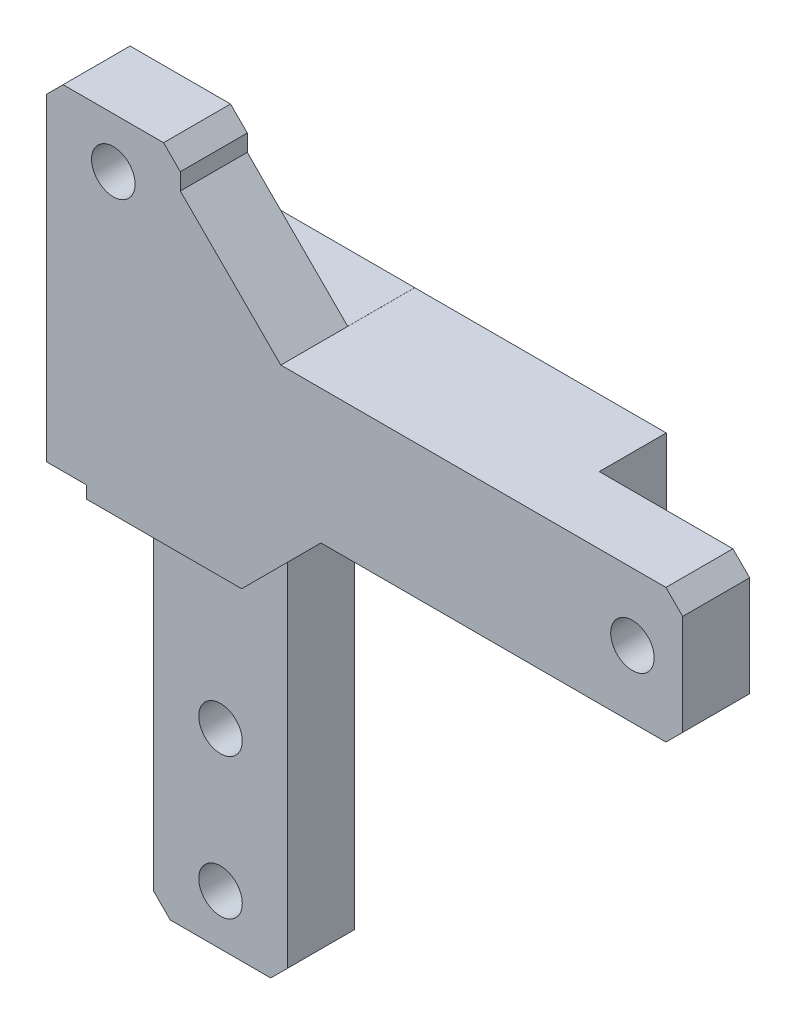
ISO-10303-21;
HEADER;
FILE_DESCRIPTION(('STEP AP214'),'2;1');
FILE_NAME('part.step','',(''),(''),'','','');
FILE_SCHEMA(('AUTOMOTIVE_DESIGN { 1 0 10303 214 1 1 1 1 }'));
ENDSEC;
DATA;
#1=APPLICATION_CONTEXT('core data for automotive mechanical design processes');
#2=APPLICATION_PROTOCOL_DEFINITION('international standard','automotive_design',2000,#1);
#3=PRODUCT_CONTEXT('',#1,'mechanical');
#4=PRODUCT('Part','Part','',(#3));
#5=PRODUCT_RELATED_PRODUCT_CATEGORY('part','',(#4));
#6=PRODUCT_DEFINITION_FORMATION('','',#4);
#7=PRODUCT_DEFINITION_CONTEXT('part definition',#1,'design');
#8=PRODUCT_DEFINITION('design','',#6,#7);
#9=PRODUCT_DEFINITION_SHAPE('','',#8);
#10=(LENGTH_UNIT() NAMED_UNIT(*) SI_UNIT(.MILLI.,.METRE.));
#11=(NAMED_UNIT(*) PLANE_ANGLE_UNIT() SI_UNIT($,.RADIAN.));
#12=(NAMED_UNIT(*) SI_UNIT($,.STERADIAN.) SOLID_ANGLE_UNIT());
#13=UNCERTAINTY_MEASURE_WITH_UNIT(LENGTH_MEASURE(1.E-05),#10,'distance_accuracy_value','');
#14=(GEOMETRIC_REPRESENTATION_CONTEXT(3) GLOBAL_UNCERTAINTY_ASSIGNED_CONTEXT((#13)) GLOBAL_UNIT_ASSIGNED_CONTEXT((#10,
#11,#12)) REPRESENTATION_CONTEXT('',''));
#15=CARTESIAN_POINT('',(0.,0.,0.));
#16=DIRECTION('',(0.,0.,1.));
#17=DIRECTION('',(1.,0.,0.));
#18=AXIS2_PLACEMENT_3D('',#15,#16,#17);
#19=CARTESIAN_POINT('',(9.5,1.5,4.));
#20=DIRECTION('',(-1.,0.,0.));
#21=DIRECTION('',(0.,0.,1.));
#22=AXIS2_PLACEMENT_3D('',#19,#20,#21);
#23=PLANE('',#22);
#24=DIRECTION('',(0.,1.,0.));
#25=VECTOR('',#24,1.);
#26=CARTESIAN_POINT('',(9.5,1.5,4.));
#27=LINE('',#26,#25);
#28=CARTESIAN_POINT('',(9.5,-2.,4.));
#29=VERTEX_POINT('',#28);
#30=CARTESIAN_POINT('',(9.5,0.999999999999999,4.));
#31=VERTEX_POINT('',#30);
#32=EDGE_CURVE('E283',#29,#31,#27,.T.);
#33=ORIENTED_EDGE('',*,*,#32,.F.);
#34=DIRECTION('',(0.,0.,-1.));
#35=VECTOR('',#34,1.);
#36=CARTESIAN_POINT('',(9.5,-2.,4.));
#37=LINE('',#36,#35);
#38=CARTESIAN_POINT('',(9.5,-2.,2.));
#39=VERTEX_POINT('',#38);
#40=EDGE_CURVE('E397',#29,#39,#37,.T.);
#41=ORIENTED_EDGE('',*,*,#40,.T.);
#42=DIRECTION('',(0.,-1.,0.));
#43=VECTOR('',#42,1.);
#44=CARTESIAN_POINT('',(9.5,1.5,2.));
#45=LINE('',#44,#43);
#46=CARTESIAN_POINT('',(9.5,0.999999999999999,2.));
#47=VERTEX_POINT('',#46);
#48=EDGE_CURVE('E211',#47,#39,#45,.T.);
#49=ORIENTED_EDGE('',*,*,#48,.F.);
#50=DIRECTION('',(0.,0.,1.));
#51=VECTOR('',#50,1.);
#52=CARTESIAN_POINT('',(9.5,0.999999999999999,4.));
#53=LINE('',#52,#51);
#54=EDGE_CURVE('E395',#47,#31,#53,.T.);
#55=ORIENTED_EDGE('',*,*,#54,.T.);
#56=EDGE_LOOP('',(#33,#41,#49,#55));
#57=FACE_BOUND('',#56,.T.);
#58=ADVANCED_FACE('F42',(#57),#23,.F.);
#59=CARTESIAN_POINT('',(-9.5,5.5,4.));
#60=DIRECTION('',(0.,-1.,0.));
#61=DIRECTION('',(0.,0.,-1.));
#62=AXIS2_PLACEMENT_3D('',#59,#60,#61);
#63=PLANE('',#62);
#64=DIRECTION('',(1.,0.,0.));
#65=VECTOR('',#64,1.);
#66=CARTESIAN_POINT('',(-9.5,5.5,2.));
#67=LINE('',#66,#65);
#68=CARTESIAN_POINT('',(-9.,5.5,2.));
#69=VERTEX_POINT('',#68);
#70=CARTESIAN_POINT('',(-5.99999999999999,5.5,2.));
#71=VERTEX_POINT('',#70);
#72=EDGE_CURVE('E237',#69,#71,#67,.T.);
#73=ORIENTED_EDGE('',*,*,#72,.F.);
#74=DIRECTION('',(0.,0.,1.));
#75=VECTOR('',#74,1.);
#76=CARTESIAN_POINT('',(-9.,5.5,4.));
#77=LINE('',#76,#75);
#78=CARTESIAN_POINT('',(-9.,5.5,4.));
#79=VERTEX_POINT('',#78);
#80=EDGE_CURVE('E385',#69,#79,#77,.T.);
#81=ORIENTED_EDGE('',*,*,#80,.T.);
#82=DIRECTION('',(-1.,0.,0.));
#83=VECTOR('',#82,1.);
#84=CARTESIAN_POINT('',(-9.5,5.5,4.));
#85=LINE('',#84,#83);
#86=CARTESIAN_POINT('',(-5.99999999999999,5.5,4.));
#87=VERTEX_POINT('',#86);
#88=EDGE_CURVE('E291',#87,#79,#85,.T.);
#89=ORIENTED_EDGE('',*,*,#88,.F.);
#90=DIRECTION('',(0.,0.,-1.));
#91=VECTOR('',#90,1.);
#92=CARTESIAN_POINT('',(-5.99999999999999,5.5,4.));
#93=LINE('',#92,#91);
#94=EDGE_CURVE('E382',#87,#71,#93,.T.);
#95=ORIENTED_EDGE('',*,*,#94,.T.);
#96=EDGE_LOOP('',(#73,#81,#89,#95));
#97=FACE_BOUND('',#96,.T.);
#98=ADVANCED_FACE('F431',(#97),#63,.F.);
#99=CARTESIAN_POINT('',(8.,-0.5,4.));
#100=DIRECTION('',(0.,0.,-1.));
#101=DIRECTION('',(-1.,0.,0.));
#102=AXIS2_PLACEMENT_3D('',#99,#100,#101);
#103=CYLINDRICAL_SURFACE('',#102,0.649999999999999);
#104=CARTESIAN_POINT('',(8.,-0.5,4.));
#105=DIRECTION('',(0.,0.,1.));
#106=DIRECTION('',(1.,0.,0.));
#107=AXIS2_PLACEMENT_3D('',#104,#105,#106);
#108=CIRCLE('',#107,0.649999999999999);
#109=CARTESIAN_POINT('',(8.65,-0.5,4.));
#110=VERTEX_POINT('',#109);
#111=EDGE_CURVE('E279',#110,#110,#108,.T.);
#112=ORIENTED_EDGE('',*,*,#111,.T.);
#113=EDGE_LOOP('',(#112));
#114=FACE_BOUND('',#113,.T.);
#115=CARTESIAN_POINT('',(8.,-0.5,2.));
#116=DIRECTION('',(0.,0.,-1.));
#117=DIRECTION('',(-1.,0.,0.));
#118=AXIS2_PLACEMENT_3D('',#115,#116,#117);
#119=CIRCLE('',#118,0.65);
#120=CARTESIAN_POINT('',(7.35,-0.5,2.));
#121=VERTEX_POINT('',#120);
#122=EDGE_CURVE('E248',#121,#121,#119,.T.);
#123=ORIENTED_EDGE('',*,*,#122,.T.);
#124=EDGE_LOOP('',(#123));
#125=FACE_BOUND('',#124,.T.);
#126=ADVANCED_FACE('F416',(#114,#125),#103,.F.);
#127=CARTESIAN_POINT('',(-7.5,4.,4.));
#128=DIRECTION('',(0.,0.,-1.));
#129=DIRECTION('',(-1.,0.,0.));
#130=AXIS2_PLACEMENT_3D('',#127,#128,#129);
#131=CYLINDRICAL_SURFACE('',#130,0.65);
#132=CARTESIAN_POINT('',(-7.5,4.,4.));
#133=DIRECTION('',(0.,0.,1.));
#134=DIRECTION('',(1.,0.,0.));
#135=AXIS2_PLACEMENT_3D('',#132,#133,#134);
#136=CIRCLE('',#135,0.65);
#137=CARTESIAN_POINT('',(-6.85,4.,4.));
#138=VERTEX_POINT('',#137);
#139=EDGE_CURVE('E276',#138,#138,#136,.T.);
#140=ORIENTED_EDGE('',*,*,#139,.T.);
#141=EDGE_LOOP('',(#140));
#142=FACE_BOUND('',#141,.T.);
#143=CARTESIAN_POINT('',(-7.5,4.,2.));
#144=DIRECTION('',(0.,0.,-1.));
#145=DIRECTION('',(-1.,0.,0.));
#146=AXIS2_PLACEMENT_3D('',#143,#144,#145);
#147=CIRCLE('',#146,0.649999999999999);
#148=CARTESIAN_POINT('',(-8.15,4.,2.));
#149=VERTEX_POINT('',#148);
#150=EDGE_CURVE('E236',#149,#149,#147,.T.);
#151=ORIENTED_EDGE('',*,*,#150,.T.);
#152=EDGE_LOOP('',(#151));
#153=FACE_BOUND('',#152,.T.);
#154=ADVANCED_FACE('F581',(#142,#153),#131,.F.);
#155=CARTESIAN_POINT('',(-8.3,-16.5,4.));
#156=DIRECTION('',(0.,1.,0.));
#157=DIRECTION('',(0.,0.,1.));
#158=AXIS2_PLACEMENT_3D('',#155,#156,#157);
#159=PLANE('',#158);
#160=DIRECTION('',(1.,0.,0.));
#161=VECTOR('',#160,1.);
#162=CARTESIAN_POINT('',(-8.3,-16.5,0.));
#163=LINE('',#162,#161);
#164=CARTESIAN_POINT('',(-7.8,-16.5,0.));
#165=VERTEX_POINT('',#164);
#166=CARTESIAN_POINT('',(-4.8,-16.5,0.));
#167=VERTEX_POINT('',#166);
#168=EDGE_CURVE('E314',#165,#167,#163,.T.);
#169=ORIENTED_EDGE('',*,*,#168,.T.);
#170=DIRECTION('',(0.,0.,1.));
#171=VECTOR('',#170,1.);
#172=CARTESIAN_POINT('',(-4.8,-16.5,4.));
#173=LINE('',#172,#171);
#174=CARTESIAN_POINT('',(-4.8,-16.5,2.));
#175=VERTEX_POINT('',#174);
#176=EDGE_CURVE('E367',#167,#175,#173,.T.);
#177=ORIENTED_EDGE('',*,*,#176,.T.);
#178=DIRECTION('',(1.,0.,0.));
#179=VECTOR('',#178,1.);
#180=CARTESIAN_POINT('',(-8.3,-16.5,2.));
#181=LINE('',#180,#179);
#182=CARTESIAN_POINT('',(-7.8,-16.5,2.));
#183=VERTEX_POINT('',#182);
#184=EDGE_CURVE('E255',#183,#175,#181,.T.);
#185=ORIENTED_EDGE('',*,*,#184,.F.);
#186=DIRECTION('',(0.,0.,-1.));
#187=VECTOR('',#186,1.);
#188=CARTESIAN_POINT('',(-7.8,-16.5,4.));
#189=LINE('',#188,#187);
#190=EDGE_CURVE('E364',#183,#165,#189,.T.);
#191=ORIENTED_EDGE('',*,*,#190,.T.);
#192=EDGE_LOOP('',(#169,#177,#185,#191));
#193=FACE_BOUND('',#192,.T.);
#194=ADVANCED_FACE('F550',(#193),#159,.F.);
#195=CARTESIAN_POINT('',(-6.29999999999999,-15.,4.));
#196=DIRECTION('',(0.,0.,-1.));
#197=DIRECTION('',(-1.,0.,0.));
#198=AXIS2_PLACEMENT_3D('',#195,#196,#197);
#199=CYLINDRICAL_SURFACE('',#198,0.65);
#200=CARTESIAN_POINT('',(-6.29999999999999,-15.,0.));
#201=DIRECTION('',(0.,0.,1.));
#202=DIRECTION('',(1.,0.,0.));
#203=AXIS2_PLACEMENT_3D('',#200,#201,#202);
#204=CIRCLE('',#203,0.65);
#205=CARTESIAN_POINT('',(-5.65,-15.,0.));
#206=VERTEX_POINT('',#205);
#207=EDGE_CURVE('E273',#206,#206,#204,.T.);
#208=ORIENTED_EDGE('',*,*,#207,.F.);
#209=EDGE_LOOP('',(#208));
#210=FACE_BOUND('',#209,.T.);
#211=CARTESIAN_POINT('',(-6.29999999999999,-15.,2.));
#212=DIRECTION('',(0.,0.,1.));
#213=DIRECTION('',(1.,0.,0.));
#214=AXIS2_PLACEMENT_3D('',#211,#212,#213);
#215=CIRCLE('',#214,0.65);
#216=CARTESIAN_POINT('',(-5.65,-15.,2.));
#217=VERTEX_POINT('',#216);
#218=EDGE_CURVE('E251',#217,#217,#215,.T.);
#219=ORIENTED_EDGE('',*,*,#218,.T.);
#220=EDGE_LOOP('',(#219));
#221=FACE_BOUND('',#220,.T.);
#222=ADVANCED_FACE('F576',(#210,#221),#199,.F.);
#223=CARTESIAN_POINT('',(-6.29999999999999,-10.8,4.));
#224=DIRECTION('',(0.,0.,-1.));
#225=DIRECTION('',(-1.,0.,0.));
#226=AXIS2_PLACEMENT_3D('',#223,#224,#225);
#227=CYLINDRICAL_SURFACE('',#226,0.65);
#228=CARTESIAN_POINT('',(-6.29999999999999,-10.8,0.));
#229=DIRECTION('',(0.,0.,1.));
#230=DIRECTION('',(1.,0.,0.));
#231=AXIS2_PLACEMENT_3D('',#228,#229,#230);
#232=CIRCLE('',#231,0.65);
#233=CARTESIAN_POINT('',(-5.65,-10.8,0.));
#234=VERTEX_POINT('',#233);
#235=EDGE_CURVE('E270',#234,#234,#232,.T.);
#236=ORIENTED_EDGE('',*,*,#235,.F.);
#237=EDGE_LOOP('',(#236));
#238=FACE_BOUND('',#237,.T.);
#239=CARTESIAN_POINT('',(-6.29999999999999,-10.8,2.));
#240=DIRECTION('',(0.,0.,1.));
#241=DIRECTION('',(1.,0.,0.));
#242=AXIS2_PLACEMENT_3D('',#239,#240,#241);
#243=CIRCLE('',#242,0.65);
#244=CARTESIAN_POINT('',(-5.65,-10.8,2.));
#245=VERTEX_POINT('',#244);
#246=EDGE_CURVE('E226',#245,#245,#243,.T.);
#247=ORIENTED_EDGE('',*,*,#246,.T.);
#248=EDGE_LOOP('',(#247));
#249=FACE_BOUND('',#248,.T.);
#250=ADVANCED_FACE('F573',(#238,#249),#227,.F.);
#251=CARTESIAN_POINT('',(0.,0.,4.));
#252=DIRECTION('',(0.,0.,1.));
#253=DIRECTION('',(1.,0.,0.));
#254=AXIS2_PLACEMENT_3D('',#251,#252,#253);
#255=PLANE('',#254);
#256=ORIENTED_EDGE('',*,*,#88,.T.);
#257=DIRECTION('',(0.707106781186548,0.707106781186548,0.));
#258=VECTOR('',#257,1.);
#259=CARTESIAN_POINT('',(-7.25,7.25,4.));
#260=LINE('',#259,#258);
#261=CARTESIAN_POINT('',(-9.5,5.,4.));
#262=VERTEX_POINT('',#261);
#263=EDGE_CURVE('E393',#79,#262,#260,.F.);
#264=ORIENTED_EDGE('',*,*,#263,.T.);
#265=DIRECTION('',(0.,-1.,0.));
#266=VECTOR('',#265,1.);
#267=CARTESIAN_POINT('',(-9.5,1.5,4.));
#268=LINE('',#267,#266);
#269=CARTESIAN_POINT('',(-9.5,-4.5,4.));
#270=VERTEX_POINT('',#269);
#271=EDGE_CURVE('E294',#262,#270,#268,.T.);
#272=ORIENTED_EDGE('',*,*,#271,.T.);
#273=DIRECTION('',(1.,0.,0.));
#274=VECTOR('',#273,1.);
#275=CARTESIAN_POINT('',(-9.5,-4.5,4.));
#276=LINE('',#275,#274);
#277=CARTESIAN_POINT('',(-8.3,-4.5,4.));
#278=VERTEX_POINT('',#277);
#279=EDGE_CURVE('E296',#270,#278,#276,.T.);
#280=ORIENTED_EDGE('',*,*,#279,.T.);
#281=DIRECTION('',(0.,-1.,0.));
#282=VECTOR('',#281,1.);
#283=CARTESIAN_POINT('',(-8.3,-4.5,4.));
#284=LINE('',#283,#282);
#285=CARTESIAN_POINT('',(-8.3,-4.8687128154348,4.));
#286=VERTEX_POINT('',#285);
#287=EDGE_CURVE('E298',#278,#286,#284,.T.);
#288=ORIENTED_EDGE('',*,*,#287,.T.);
#289=DIRECTION('',(-1.,0.,0.));
#290=VECTOR('',#289,1.);
#291=CARTESIAN_POINT('',(-8.3,-4.8687128154348,4.));
#292=LINE('',#291,#290);
#293=CARTESIAN_POINT('',(-3.6687128154348,-4.8687128154348,4.));
#294=VERTEX_POINT('',#293);
#295=EDGE_CURVE('E254',#294,#286,#292,.T.);
#296=ORIENTED_EDGE('',*,*,#295,.F.);
#297=DIRECTION('',(-0.707106781186551,-0.707106781186544,0.));
#298=VECTOR('',#297,1.);
#299=CARTESIAN_POINT('',(-1.29999999999997,-2.5,4.));
#300=LINE('',#299,#298);
#301=CARTESIAN_POINT('',(-1.29999999999997,-2.5,4.));
#302=VERTEX_POINT('',#301);
#303=EDGE_CURVE('E345',#294,#302,#300,.F.);
#304=ORIENTED_EDGE('',*,*,#303,.T.);
#305=DIRECTION('',(1.,0.,0.));
#306=VECTOR('',#305,1.);
#307=CARTESIAN_POINT('',(-4.29999999999999,-2.5,4.));
#308=LINE('',#307,#306);
#309=CARTESIAN_POINT('',(9.,-2.5,4.));
#310=VERTEX_POINT('',#309);
#311=EDGE_CURVE('E301',#302,#310,#308,.T.);
#312=ORIENTED_EDGE('',*,*,#311,.T.);
#313=DIRECTION('',(-0.70710678118655,-0.707106781186545,0.));
#314=VECTOR('',#313,1.);
#315=CARTESIAN_POINT('',(5.74999999999997,-5.75000000000001,4.));
#316=LINE('',#315,#314);
#317=EDGE_CURVE('E391',#310,#29,#316,.F.);
#318=ORIENTED_EDGE('',*,*,#317,.T.);
#319=ORIENTED_EDGE('',*,*,#32,.T.);
#320=DIRECTION('',(0.707106781186548,-0.707106781186548,0.));
#321=VECTOR('',#320,1.);
#322=CARTESIAN_POINT('',(5.25,5.25,4.));
#323=LINE('',#322,#321);
#324=CARTESIAN_POINT('',(9.,1.5,4.));
#325=VERTEX_POINT('',#324);
#326=EDGE_CURVE('E389',#31,#325,#323,.F.);
#327=ORIENTED_EDGE('',*,*,#326,.T.);
#328=DIRECTION('',(-1.,0.,0.));
#329=VECTOR('',#328,1.);
#330=CARTESIAN_POINT('',(-5.5,1.5,4.));
#331=LINE('',#330,#329);
#332=CARTESIAN_POINT('',(-2.50000000000001,1.5,4.));
#333=VERTEX_POINT('',#332);
#334=EDGE_CURVE('E286',#325,#333,#331,.T.);
#335=ORIENTED_EDGE('',*,*,#334,.T.);
#336=DIRECTION('',(0.707106781186544,-0.707106781186551,0.));
#337=VECTOR('',#336,1.);
#338=CARTESIAN_POINT('',(-5.5,4.50000000000002,4.));
#339=LINE('',#338,#337);
#340=CARTESIAN_POINT('',(-5.5,4.50000000000002,4.));
#341=VERTEX_POINT('',#340);
#342=EDGE_CURVE('E355',#333,#341,#339,.F.);
#343=ORIENTED_EDGE('',*,*,#342,.T.);
#344=DIRECTION('',(0.,1.,0.));
#345=VECTOR('',#344,1.);
#346=CARTESIAN_POINT('',(-5.5,1.5,4.));
#347=LINE('',#346,#345);
#348=CARTESIAN_POINT('',(-5.5,5.,4.));
#349=VERTEX_POINT('',#348);
#350=EDGE_CURVE('E288',#341,#349,#347,.T.);
#351=ORIENTED_EDGE('',*,*,#350,.T.);
#352=DIRECTION('',(0.707106781186548,-0.707106781186548,0.));
#353=VECTOR('',#352,1.);
#354=CARTESIAN_POINT('',(-0.249999999999998,-0.249999999999998,4.));
#355=LINE('',#354,#353);
#356=EDGE_CURVE('E387',#349,#87,#355,.F.);
#357=ORIENTED_EDGE('',*,*,#356,.T.);
#358=EDGE_LOOP('',(#256,#264,#272,#280,#288,#296,#304,#312,#318,#319,#327,#335,#343,#351,#357));
#359=FACE_BOUND('',#358,.T.);
#360=ORIENTED_EDGE('',*,*,#111,.F.);
#361=EDGE_LOOP('',(#360));
#362=FACE_BOUND('',#361,.T.);
#363=ORIENTED_EDGE('',*,*,#139,.F.);
#364=EDGE_LOOP('',(#363));
#365=FACE_BOUND('',#364,.T.);
#366=ADVANCED_FACE('F489',(#359,#362,#365),#255,.T.);
#367=CARTESIAN_POINT('',(0.,0.,0.));
#368=DIRECTION('',(0.,0.,1.));
#369=DIRECTION('',(1.,0.,0.));
#370=AXIS2_PLACEMENT_3D('',#367,#368,#369);
#371=PLANE('',#370);
#372=DIRECTION('',(0.,1.,0.));
#373=VECTOR('',#372,1.);
#374=CARTESIAN_POINT('',(-4.29999999999999,-16.5,0.));
#375=LINE('',#374,#373);
#376=CARTESIAN_POINT('',(-4.29999999999999,-16.,0.));
#377=VERTEX_POINT('',#376);
#378=CARTESIAN_POINT('',(-4.29999999999999,-5.49999999999999,0.));
#379=VERTEX_POINT('',#378);
#380=EDGE_CURVE('E317',#377,#379,#375,.T.);
#381=ORIENTED_EDGE('',*,*,#380,.F.);
#382=DIRECTION('',(0.70710678118655,0.707106781186545,0.));
#383=VECTOR('',#382,1.);
#384=CARTESIAN_POINT('',(-4.29999999999999,-16.,0.));
#385=LINE('',#384,#383);
#386=EDGE_CURVE('E362',#377,#167,#385,.F.);
#387=ORIENTED_EDGE('',*,*,#386,.T.);
#388=ORIENTED_EDGE('',*,*,#168,.F.);
#389=DIRECTION('',(0.707106781186545,-0.70710678118655,0.));
#390=VECTOR('',#389,1.);
#391=CARTESIAN_POINT('',(-7.8,-16.5,0.));
#392=LINE('',#391,#390);
#393=CARTESIAN_POINT('',(-8.3,-16.,0.));
#394=VERTEX_POINT('',#393);
#395=EDGE_CURVE('E360',#165,#394,#392,.F.);
#396=ORIENTED_EDGE('',*,*,#395,.T.);
#397=DIRECTION('',(0.,-1.,0.));
#398=VECTOR('',#397,1.);
#399=CARTESIAN_POINT('',(-8.3,-4.5,0.));
#400=LINE('',#399,#398);
#401=CARTESIAN_POINT('',(-8.3,-4.5,0.));
#402=VERTEX_POINT('',#401);
#403=EDGE_CURVE('E311',#402,#394,#400,.T.);
#404=ORIENTED_EDGE('',*,*,#403,.F.);
#405=DIRECTION('',(1.,0.,0.));
#406=VECTOR('',#405,1.);
#407=CARTESIAN_POINT('',(-9.5,-4.5,0.));
#408=LINE('',#407,#406);
#409=CARTESIAN_POINT('',(-9.5,-4.5,0.));
#410=VERTEX_POINT('',#409);
#411=EDGE_CURVE('E309',#410,#402,#408,.T.);
#412=ORIENTED_EDGE('',*,*,#411,.F.);
#413=DIRECTION('',(0.,-1.,0.));
#414=VECTOR('',#413,1.);
#415=CARTESIAN_POINT('',(-9.5,1.5,0.));
#416=LINE('',#415,#414);
#417=CARTESIAN_POINT('',(-9.5,1.50112500265622,0.));
#418=VERTEX_POINT('',#417);
#419=EDGE_CURVE('E307',#418,#410,#416,.T.);
#420=ORIENTED_EDGE('',*,*,#419,.F.);
#421=DIRECTION('',(-1.,0.,0.));
#422=VECTOR('',#421,1.);
#423=CARTESIAN_POINT('',(-5.5,1.50112500265622,0.));
#424=LINE('',#423,#422);
#425=CARTESIAN_POINT('',(-2.50112500265622,1.50112500265622,0.));
#426=VERTEX_POINT('',#425);
#427=EDGE_CURVE('E234',#426,#418,#424,.T.);
#428=ORIENTED_EDGE('',*,*,#427,.F.);
#429=DIRECTION('',(-0.707106781186544,0.707106781186551,0.));
#430=VECTOR('',#429,1.);
#431=CARTESIAN_POINT('',(-0.500000000000016,-0.500000000000011,0.));
#432=LINE('',#431,#430);
#433=CARTESIAN_POINT('',(-2.50000000000001,1.5,0.));
#434=VERTEX_POINT('',#433);
#435=EDGE_CURVE('E353',#426,#434,#432,.F.);
#436=ORIENTED_EDGE('',*,*,#435,.T.);
#437=DIRECTION('',(-1.,0.,0.));
#438=VECTOR('',#437,1.);
#439=CARTESIAN_POINT('',(-5.5,1.5,0.));
#440=LINE('',#439,#438);
#441=CARTESIAN_POINT('',(5.01005685993889,1.5,0.));
#442=VERTEX_POINT('',#441);
#443=EDGE_CURVE('E282',#442,#434,#440,.T.);
#444=ORIENTED_EDGE('',*,*,#443,.F.);
#445=DIRECTION('',(0.,1.,0.));
#446=VECTOR('',#445,1.);
#447=CARTESIAN_POINT('',(5.01005685993889,1.5,0.));
#448=LINE('',#447,#446);
#449=CARTESIAN_POINT('',(5.01005685993889,-2.5,0.));
#450=VERTEX_POINT('',#449);
#451=EDGE_CURVE('E409',#450,#442,#448,.T.);
#452=ORIENTED_EDGE('',*,*,#451,.F.);
#453=DIRECTION('',(1.,0.,0.));
#454=VECTOR('',#453,1.);
#455=CARTESIAN_POINT('',(-4.29999999999999,-2.5,0.));
#456=LINE('',#455,#454);
#457=CARTESIAN_POINT('',(-1.29999999999997,-2.5,0.));
#458=VERTEX_POINT('',#457);
#459=EDGE_CURVE('E224',#458,#450,#456,.T.);
#460=ORIENTED_EDGE('',*,*,#459,.F.);
#461=DIRECTION('',(0.707106781186551,0.707106781186544,0.));
#462=VECTOR('',#461,1.);
#463=CARTESIAN_POINT('',(0.600000000000021,-0.600000000000028,0.));
#464=LINE('',#463,#462);
#465=EDGE_CURVE('E336',#458,#379,#464,.F.);
#466=ORIENTED_EDGE('',*,*,#465,.T.);
#467=EDGE_LOOP('',(#381,#387,#388,#396,#404,#412,#420,#428,#436,#444,#452,#460,#466));
#468=FACE_BOUND('',#467,.T.);
#469=ORIENTED_EDGE('',*,*,#207,.T.);
#470=EDGE_LOOP('',(#469));
#471=FACE_BOUND('',#470,.T.);
#472=ORIENTED_EDGE('',*,*,#235,.T.);
#473=EDGE_LOOP('',(#472));
#474=FACE_BOUND('',#473,.T.);
#475=ADVANCED_FACE('F501',(#468,#471,#474),#371,.F.);
#476=CARTESIAN_POINT('',(-5.5,1.5,4.));
#477=DIRECTION('',(0.,-1.,0.));
#478=DIRECTION('',(1.,0.,0.));
#479=AXIS2_PLACEMENT_3D('',#476,#477,#478);
#480=PLANE('',#479);
#481=ORIENTED_EDGE('',*,*,#334,.F.);
#482=DIRECTION('',(0.,0.,-1.));
#483=VECTOR('',#482,1.);
#484=CARTESIAN_POINT('',(9.,1.5,4.));
#485=LINE('',#484,#483);
#486=CARTESIAN_POINT('',(9.,1.5,2.));
#487=VERTEX_POINT('',#486);
#488=EDGE_CURVE('E51',#325,#487,#485,.T.);
#489=ORIENTED_EDGE('',*,*,#488,.T.);
#490=DIRECTION('',(1.,0.,0.));
#491=VECTOR('',#490,1.);
#492=CARTESIAN_POINT('',(5.01005685993889,1.5,2.));
#493=LINE('',#492,#491);
#494=CARTESIAN_POINT('',(5.01005685993889,1.5,2.));
#495=VERTEX_POINT('',#494);
#496=EDGE_CURVE('E406',#495,#487,#493,.T.);
#497=ORIENTED_EDGE('',*,*,#496,.F.);
#498=DIRECTION('',(0.,0.,-1.));
#499=VECTOR('',#498,1.);
#500=CARTESIAN_POINT('',(5.01005685993889,1.5,2.));
#501=LINE('',#500,#499);
#502=EDGE_CURVE('E219',#495,#442,#501,.T.);
#503=ORIENTED_EDGE('',*,*,#502,.T.);
#504=ORIENTED_EDGE('',*,*,#443,.T.);
#505=DIRECTION('',(0.,0.,1.));
#506=VECTOR('',#505,1.);
#507=CARTESIAN_POINT('',(-2.50000000000001,1.5,4.));
#508=LINE('',#507,#506);
#509=EDGE_CURVE('E333',#434,#333,#508,.T.);
#510=ORIENTED_EDGE('',*,*,#509,.T.);
#511=EDGE_LOOP('',(#481,#489,#497,#503,#504,#510));
#512=FACE_BOUND('',#511,.T.);
#513=ADVANCED_FACE('F405',(#512),#480,.F.);
#514=CARTESIAN_POINT('',(-5.5,1.5,4.));
#515=DIRECTION('',(-1.,0.,0.));
#516=DIRECTION('',(0.,0.,1.));
#517=AXIS2_PLACEMENT_3D('',#514,#515,#516);
#518=PLANE('',#517);
#519=DIRECTION('',(0.,-1.,0.));
#520=VECTOR('',#519,1.);
#521=CARTESIAN_POINT('',(-5.5,5.5,2.));
#522=LINE('',#521,#520);
#523=CARTESIAN_POINT('',(-5.5,5.,2.));
#524=VERTEX_POINT('',#523);
#525=CARTESIAN_POINT('',(-5.5,4.50000000000002,2.));
#526=VERTEX_POINT('',#525);
#527=EDGE_CURVE('E242',#524,#526,#522,.T.);
#528=ORIENTED_EDGE('',*,*,#527,.F.);
#529=DIRECTION('',(0.,0.,1.));
#530=VECTOR('',#529,1.);
#531=CARTESIAN_POINT('',(-5.5,5.,4.));
#532=LINE('',#531,#530);
#533=EDGE_CURVE('E12',#524,#349,#532,.T.);
#534=ORIENTED_EDGE('',*,*,#533,.T.);
#535=ORIENTED_EDGE('',*,*,#350,.F.);
#536=DIRECTION('',(0.,0.,-1.));
#537=VECTOR('',#536,1.);
#538=CARTESIAN_POINT('',(-5.5,4.50000000000002,0.));
#539=LINE('',#538,#537);
#540=EDGE_CURVE('E330',#341,#526,#539,.T.);
#541=ORIENTED_EDGE('',*,*,#540,.T.);
#542=EDGE_LOOP('',(#528,#534,#535,#541));
#543=FACE_BOUND('',#542,.T.);
#544=ADVANCED_FACE('F514',(#543),#518,.F.);
#545=CARTESIAN_POINT('',(-9.5,1.5,4.));
#546=DIRECTION('',(1.,0.,0.));
#547=DIRECTION('',(0.,1.,0.));
#548=AXIS2_PLACEMENT_3D('',#545,#546,#547);
#549=PLANE('',#548);
#550=ORIENTED_EDGE('',*,*,#271,.F.);
#551=DIRECTION('',(0.,0.,-1.));
#552=VECTOR('',#551,1.);
#553=CARTESIAN_POINT('',(-9.5,5.,4.));
#554=LINE('',#553,#552);
#555=CARTESIAN_POINT('',(-9.5,5.,2.));
#556=VERTEX_POINT('',#555);
#557=EDGE_CURVE('E375',#262,#556,#554,.T.);
#558=ORIENTED_EDGE('',*,*,#557,.T.);
#559=DIRECTION('',(0.,1.,0.));
#560=VECTOR('',#559,1.);
#561=CARTESIAN_POINT('',(-9.5,1.50112500265622,2.));
#562=LINE('',#561,#560);
#563=CARTESIAN_POINT('',(-9.5,1.50112500265622,2.));
#564=VERTEX_POINT('',#563);
#565=EDGE_CURVE('E233',#564,#556,#562,.T.);
#566=ORIENTED_EDGE('',*,*,#565,.F.);
#567=DIRECTION('',(0.,0.,-1.));
#568=VECTOR('',#567,1.);
#569=CARTESIAN_POINT('',(-9.5,1.50112500265622,2.));
#570=LINE('',#569,#568);
#571=EDGE_CURVE('E230',#564,#418,#570,.T.);
#572=ORIENTED_EDGE('',*,*,#571,.T.);
#573=ORIENTED_EDGE('',*,*,#419,.T.);
#574=DIRECTION('',(0.,0.,-1.));
#575=VECTOR('',#574,1.);
#576=CARTESIAN_POINT('',(-9.5,-4.5,4.));
#577=LINE('',#576,#575);
#578=EDGE_CURVE('E322',#270,#410,#577,.T.);
#579=ORIENTED_EDGE('',*,*,#578,.F.);
#580=EDGE_LOOP('',(#550,#558,#566,#572,#573,#579));
#581=FACE_BOUND('',#580,.T.);
#582=ADVANCED_FACE('F525',(#581),#549,.F.);
#583=CARTESIAN_POINT('',(-9.5,-4.5,4.));
#584=DIRECTION('',(0.,1.,0.));
#585=DIRECTION('',(0.,0.,1.));
#586=AXIS2_PLACEMENT_3D('',#583,#584,#585);
#587=PLANE('',#586);
#588=ORIENTED_EDGE('',*,*,#411,.T.);
#589=DIRECTION('',(0.,0.,-1.));
#590=VECTOR('',#589,1.);
#591=CARTESIAN_POINT('',(-8.3,-4.5,4.));
#592=LINE('',#591,#590);
#593=EDGE_CURVE('E304',#278,#402,#592,.T.);
#594=ORIENTED_EDGE('',*,*,#593,.F.);
#595=ORIENTED_EDGE('',*,*,#279,.F.);
#596=ORIENTED_EDGE('',*,*,#578,.T.);
#597=EDGE_LOOP('',(#588,#594,#595,#596));
#598=FACE_BOUND('',#597,.T.);
#599=ADVANCED_FACE('F532',(#598),#587,.F.);
#600=CARTESIAN_POINT('',(-8.3,-4.5,4.));
#601=DIRECTION('',(1.,0.,0.));
#602=DIRECTION('',(0.,1.,0.));
#603=AXIS2_PLACEMENT_3D('',#600,#601,#602);
#604=PLANE('',#603);
#605=ORIENTED_EDGE('',*,*,#403,.T.);
#606=DIRECTION('',(0.,0.,1.));
#607=VECTOR('',#606,1.);
#608=CARTESIAN_POINT('',(-8.3,-16.,4.));
#609=LINE('',#608,#607);
#610=CARTESIAN_POINT('',(-8.3,-16.,2.));
#611=VERTEX_POINT('',#610);
#612=EDGE_CURVE('E373',#394,#611,#609,.T.);
#613=ORIENTED_EDGE('',*,*,#612,.T.);
#614=DIRECTION('',(0.,-1.,0.));
#615=VECTOR('',#614,1.);
#616=CARTESIAN_POINT('',(-8.3,-4.8687128154348,2.));
#617=LINE('',#616,#615);
#618=CARTESIAN_POINT('',(-8.3,-4.8687128154348,2.));
#619=VERTEX_POINT('',#618);
#620=EDGE_CURVE('E263',#619,#611,#617,.T.);
#621=ORIENTED_EDGE('',*,*,#620,.F.);
#622=DIRECTION('',(0.,0.,1.));
#623=VECTOR('',#622,1.);
#624=CARTESIAN_POINT('',(-8.3,-4.8687128154348,2.));
#625=LINE('',#624,#623);
#626=EDGE_CURVE('E266',#619,#286,#625,.T.);
#627=ORIENTED_EDGE('',*,*,#626,.T.);
#628=ORIENTED_EDGE('',*,*,#287,.F.);
#629=ORIENTED_EDGE('',*,*,#593,.T.);
#630=EDGE_LOOP('',(#605,#613,#621,#627,#628,#629));
#631=FACE_BOUND('',#630,.T.);
#632=ADVANCED_FACE('F535',(#631),#604,.F.);
#633=CARTESIAN_POINT('',(-4.29999999999999,-16.5,4.));
#634=DIRECTION('',(-1.,0.,0.));
#635=DIRECTION('',(0.,0.,1.));
#636=AXIS2_PLACEMENT_3D('',#633,#634,#635);
#637=PLANE('',#636);
#638=DIRECTION('',(0.,1.,0.));
#639=VECTOR('',#638,1.);
#640=CARTESIAN_POINT('',(-4.29999999999999,-16.5,2.));
#641=LINE('',#640,#639);
#642=CARTESIAN_POINT('',(-4.29999999999999,-16.,2.));
#643=VERTEX_POINT('',#642);
#644=CARTESIAN_POINT('',(-4.29999999999999,-5.49999999999999,2.));
#645=VERTEX_POINT('',#644);
#646=EDGE_CURVE('E258',#643,#645,#641,.T.);
#647=ORIENTED_EDGE('',*,*,#646,.F.);
#648=DIRECTION('',(0.,0.,-1.));
#649=VECTOR('',#648,1.);
#650=CARTESIAN_POINT('',(-4.29999999999999,-16.,4.));
#651=LINE('',#650,#649);
#652=EDGE_CURVE('E357',#643,#377,#651,.T.);
#653=ORIENTED_EDGE('',*,*,#652,.T.);
#654=ORIENTED_EDGE('',*,*,#380,.T.);
#655=DIRECTION('',(0.,0.,1.));
#656=VECTOR('',#655,1.);
#657=CARTESIAN_POINT('',(-4.29999999999999,-5.49999999999999,4.));
#658=LINE('',#657,#656);
#659=EDGE_CURVE('E327',#379,#645,#658,.T.);
#660=ORIENTED_EDGE('',*,*,#659,.T.);
#661=EDGE_LOOP('',(#647,#653,#654,#660));
#662=FACE_BOUND('',#661,.T.);
#663=ADVANCED_FACE('F545',(#662),#637,.F.);
#664=CARTESIAN_POINT('',(-4.29999999999999,-2.5,4.));
#665=DIRECTION('',(0.,1.,0.));
#666=DIRECTION('',(0.,0.,1.));
#667=AXIS2_PLACEMENT_3D('',#664,#665,#666);
#668=PLANE('',#667);
#669=DIRECTION('',(-1.,0.,0.));
#670=VECTOR('',#669,1.);
#671=CARTESIAN_POINT('',(9.5,-2.5,2.));
#672=LINE('',#671,#670);
#673=CARTESIAN_POINT('',(9.,-2.5,2.));
#674=VERTEX_POINT('',#673);
#675=CARTESIAN_POINT('',(5.01005685993889,-2.5,2.));
#676=VERTEX_POINT('',#675);
#677=EDGE_CURVE('E202',#674,#676,#672,.T.);
#678=ORIENTED_EDGE('',*,*,#677,.F.);
#679=DIRECTION('',(0.,0.,1.));
#680=VECTOR('',#679,1.);
#681=CARTESIAN_POINT('',(9.,-2.5,4.));
#682=LINE('',#681,#680);
#683=EDGE_CURVE('E402',#674,#310,#682,.T.);
#684=ORIENTED_EDGE('',*,*,#683,.T.);
#685=ORIENTED_EDGE('',*,*,#311,.F.);
#686=DIRECTION('',(0.,0.,-1.));
#687=VECTOR('',#686,1.);
#688=CARTESIAN_POINT('',(-1.29999999999997,-2.5,0.));
#689=LINE('',#688,#687);
#690=EDGE_CURVE('E325',#302,#458,#689,.T.);
#691=ORIENTED_EDGE('',*,*,#690,.T.);
#692=ORIENTED_EDGE('',*,*,#459,.T.);
#693=DIRECTION('',(0.,0.,-1.));
#694=VECTOR('',#693,1.);
#695=CARTESIAN_POINT('',(5.01005685993889,-2.5,2.));
#696=LINE('',#695,#694);
#697=EDGE_CURVE('E216',#676,#450,#696,.T.);
#698=ORIENTED_EDGE('',*,*,#697,.F.);
#699=EDGE_LOOP('',(#678,#684,#685,#691,#692,#698));
#700=FACE_BOUND('',#699,.T.);
#701=ADVANCED_FACE('F221',(#700),#668,.F.);
#702=CARTESIAN_POINT('',(-8.3,-4.8687128154348,2.));
#703=DIRECTION('',(0.,1.,0.));
#704=DIRECTION('',(0.,0.,1.));
#705=AXIS2_PLACEMENT_3D('',#702,#703,#704);
#706=PLANE('',#705);
#707=ORIENTED_EDGE('',*,*,#295,.T.);
#708=ORIENTED_EDGE('',*,*,#626,.F.);
#709=DIRECTION('',(-1.,0.,0.));
#710=VECTOR('',#709,1.);
#711=CARTESIAN_POINT('',(-8.3,-4.8687128154348,2.));
#712=LINE('',#711,#710);
#713=CARTESIAN_POINT('',(-3.6687128154348,-4.8687128154348,2.));
#714=VERTEX_POINT('',#713);
#715=EDGE_CURVE('E260',#714,#619,#712,.T.);
#716=ORIENTED_EDGE('',*,*,#715,.F.);
#717=DIRECTION('',(0.,0.,-1.));
#718=VECTOR('',#717,1.);
#719=CARTESIAN_POINT('',(-3.6687128154348,-4.8687128154348,2.));
#720=LINE('',#719,#718);
#721=EDGE_CURVE('E342',#714,#294,#720,.F.);
#722=ORIENTED_EDGE('',*,*,#721,.T.);
#723=EDGE_LOOP('',(#707,#708,#716,#722));
#724=FACE_BOUND('',#723,.T.);
#725=ADVANCED_FACE('F539',(#724),#706,.F.);
#726=CARTESIAN_POINT('',(0.,0.,2.));
#727=DIRECTION('',(0.,0.,1.));
#728=DIRECTION('',(1.,0.,0.));
#729=AXIS2_PLACEMENT_3D('',#726,#727,#728);
#730=PLANE('',#729);
#731=ORIENTED_EDGE('',*,*,#246,.F.);
#732=EDGE_LOOP('',(#731));
#733=FACE_BOUND('',#732,.T.);
#734=ORIENTED_EDGE('',*,*,#218,.F.);
#735=EDGE_LOOP('',(#734));
#736=FACE_BOUND('',#735,.T.);
#737=ORIENTED_EDGE('',*,*,#184,.T.);
#738=DIRECTION('',(-0.70710678118655,-0.707106781186545,0.));
#739=VECTOR('',#738,1.);
#740=CARTESIAN_POINT('',(5.85000000000001,-5.85000000000006,2.));
#741=LINE('',#740,#739);
#742=EDGE_CURVE('E371',#175,#643,#741,.F.);
#743=ORIENTED_EDGE('',*,*,#742,.T.);
#744=ORIENTED_EDGE('',*,*,#646,.T.);
#745=DIRECTION('',(-0.707106781186551,-0.707106781186544,0.));
#746=VECTOR('',#745,1.);
#747=CARTESIAN_POINT('',(-1.29999999999997,-2.5,2.));
#748=LINE('',#747,#746);
#749=EDGE_CURVE('E339',#645,#714,#748,.F.);
#750=ORIENTED_EDGE('',*,*,#749,.T.);
#751=ORIENTED_EDGE('',*,*,#715,.T.);
#752=ORIENTED_EDGE('',*,*,#620,.T.);
#753=DIRECTION('',(-0.707106781186545,0.70710678118655,0.));
#754=VECTOR('',#753,1.);
#755=CARTESIAN_POINT('',(-12.15,-12.1499999999999,2.));
#756=LINE('',#755,#754);
#757=EDGE_CURVE('E369',#611,#183,#756,.F.);
#758=ORIENTED_EDGE('',*,*,#757,.T.);
#759=EDGE_LOOP('',(#737,#743,#744,#750,#751,#752,#758));
#760=FACE_BOUND('',#759,.T.);
#761=ADVANCED_FACE('F541',(#733,#736,#760),#730,.T.);
#762=CARTESIAN_POINT('',(-5.5,1.50112500265622,2.));
#763=DIRECTION('',(0.,-1.,0.));
#764=DIRECTION('',(0.,0.,-1.));
#765=AXIS2_PLACEMENT_3D('',#762,#763,#764);
#766=PLANE('',#765);
#767=ORIENTED_EDGE('',*,*,#427,.T.);
#768=ORIENTED_EDGE('',*,*,#571,.F.);
#769=DIRECTION('',(-1.,0.,0.));
#770=VECTOR('',#769,1.);
#771=CARTESIAN_POINT('',(-5.5,1.50112500265622,2.));
#772=LINE('',#771,#770);
#773=CARTESIAN_POINT('',(-2.50112500265622,1.50112500265622,2.));
#774=VERTEX_POINT('',#773);
#775=EDGE_CURVE('E240',#774,#564,#772,.T.);
#776=ORIENTED_EDGE('',*,*,#775,.F.);
#777=DIRECTION('',(0.,0.,1.));
#778=VECTOR('',#777,1.);
#779=CARTESIAN_POINT('',(-2.50112500265622,1.50112500265622,2.));
#780=LINE('',#779,#778);
#781=EDGE_CURVE('E350',#774,#426,#780,.F.);
#782=ORIENTED_EDGE('',*,*,#781,.T.);
#783=EDGE_LOOP('',(#767,#768,#776,#782));
#784=FACE_BOUND('',#783,.T.);
#785=ADVANCED_FACE('F557',(#784),#766,.F.);
#786=CARTESIAN_POINT('',(0.,0.,2.));
#787=DIRECTION('',(0.,0.,-1.));
#788=DIRECTION('',(-1.,0.,0.));
#789=AXIS2_PLACEMENT_3D('',#786,#787,#788);
#790=PLANE('',#789);
#791=ORIENTED_EDGE('',*,*,#150,.F.);
#792=EDGE_LOOP('',(#791));
#793=FACE_BOUND('',#792,.T.);
#794=ORIENTED_EDGE('',*,*,#565,.T.);
#795=DIRECTION('',(-0.707106781186548,-0.707106781186548,0.));
#796=VECTOR('',#795,1.);
#797=CARTESIAN_POINT('',(-7.25,7.25,2.));
#798=LINE('',#797,#796);
#799=EDGE_CURVE('E380',#556,#69,#798,.F.);
#800=ORIENTED_EDGE('',*,*,#799,.T.);
#801=ORIENTED_EDGE('',*,*,#72,.T.);
#802=DIRECTION('',(-0.707106781186548,0.707106781186548,0.));
#803=VECTOR('',#802,1.);
#804=CARTESIAN_POINT('',(-0.249999999999998,-0.249999999999998,2.));
#805=LINE('',#804,#803);
#806=EDGE_CURVE('E378',#71,#524,#805,.F.);
#807=ORIENTED_EDGE('',*,*,#806,.T.);
#808=ORIENTED_EDGE('',*,*,#527,.T.);
#809=DIRECTION('',(-0.707106781186544,0.707106781186551,0.));
#810=VECTOR('',#809,1.);
#811=CARTESIAN_POINT('',(-5.5,4.50000000000002,2.));
#812=LINE('',#811,#810);
#813=EDGE_CURVE('E347',#526,#774,#812,.F.);
#814=ORIENTED_EDGE('',*,*,#813,.T.);
#815=ORIENTED_EDGE('',*,*,#775,.T.);
#816=EDGE_LOOP('',(#794,#800,#801,#807,#808,#814,#815));
#817=FACE_BOUND('',#816,.T.);
#818=ADVANCED_FACE('F428',(#793,#817),#790,.T.);
#819=CARTESIAN_POINT('',(5.01005685993889,1.5,2.));
#820=DIRECTION('',(-1.,0.,0.));
#821=DIRECTION('',(0.,0.,1.));
#822=AXIS2_PLACEMENT_3D('',#819,#820,#821);
#823=PLANE('',#822);
#824=ORIENTED_EDGE('',*,*,#451,.T.);
#825=ORIENTED_EDGE('',*,*,#502,.F.);
#826=DIRECTION('',(0.,1.,0.));
#827=VECTOR('',#826,1.);
#828=CARTESIAN_POINT('',(5.01005685993889,1.5,2.));
#829=LINE('',#828,#827);
#830=EDGE_CURVE('E206',#676,#495,#829,.T.);
#831=ORIENTED_EDGE('',*,*,#830,.F.);
#832=ORIENTED_EDGE('',*,*,#697,.T.);
#833=EDGE_LOOP('',(#824,#825,#831,#832));
#834=FACE_BOUND('',#833,.T.);
#835=ADVANCED_FACE('F215',(#834),#823,.F.);
#836=CARTESIAN_POINT('',(0.,0.,2.));
#837=DIRECTION('',(0.,0.,-1.));
#838=DIRECTION('',(-1.,0.,0.));
#839=AXIS2_PLACEMENT_3D('',#836,#837,#838);
#840=PLANE('',#839);
#841=ORIENTED_EDGE('',*,*,#122,.F.);
#842=EDGE_LOOP('',(#841));
#843=FACE_BOUND('',#842,.T.);
#844=ORIENTED_EDGE('',*,*,#48,.T.);
#845=DIRECTION('',(0.70710678118655,0.707106781186545,0.));
#846=VECTOR('',#845,1.);
#847=CARTESIAN_POINT('',(5.74999999999997,-5.75000000000001,2.));
#848=LINE('',#847,#846);
#849=EDGE_CURVE('E58',#39,#674,#848,.F.);
#850=ORIENTED_EDGE('',*,*,#849,.T.);
#851=ORIENTED_EDGE('',*,*,#677,.T.);
#852=ORIENTED_EDGE('',*,*,#830,.T.);
#853=ORIENTED_EDGE('',*,*,#496,.T.);
#854=DIRECTION('',(-0.707106781186548,0.707106781186548,0.));
#855=VECTOR('',#854,1.);
#856=CARTESIAN_POINT('',(5.25,5.25,2.));
#857=LINE('',#856,#855);
#858=EDGE_CURVE('E66',#487,#47,#857,.F.);
#859=ORIENTED_EDGE('',*,*,#858,.T.);
#860=EDGE_LOOP('',(#844,#850,#851,#852,#853,#859));
#861=FACE_BOUND('',#860,.T.);
#862=ADVANCED_FACE('F204',(#843,#861),#840,.T.);
#863=CARTESIAN_POINT('',(-1.29999999999997,-2.5,4.));
#864=DIRECTION('',(0.707106781186544,-0.707106781186551,0.));
#865=DIRECTION('',(0.,0.,1.));
#866=AXIS2_PLACEMENT_3D('',#863,#864,#865);
#867=PLANE('',#866);
#868=ORIENTED_EDGE('',*,*,#749,.F.);
#869=ORIENTED_EDGE('',*,*,#659,.F.);
#870=ORIENTED_EDGE('',*,*,#465,.F.);
#871=ORIENTED_EDGE('',*,*,#690,.F.);
#872=ORIENTED_EDGE('',*,*,#303,.F.);
#873=ORIENTED_EDGE('',*,*,#721,.F.);
#874=EDGE_LOOP('',(#868,#869,#870,#871,#872,#873));
#875=FACE_BOUND('',#874,.T.);
#876=ADVANCED_FACE('F419',(#875),#867,.T.);
#877=CARTESIAN_POINT('',(-5.5,4.50000000000002,4.));
#878=DIRECTION('',(0.707106781186551,0.707106781186544,0.));
#879=DIRECTION('',(0.,0.,1.));
#880=AXIS2_PLACEMENT_3D('',#877,#878,#879);
#881=PLANE('',#880);
#882=ORIENTED_EDGE('',*,*,#342,.F.);
#883=ORIENTED_EDGE('',*,*,#509,.F.);
#884=ORIENTED_EDGE('',*,*,#435,.F.);
#885=ORIENTED_EDGE('',*,*,#781,.F.);
#886=ORIENTED_EDGE('',*,*,#813,.F.);
#887=ORIENTED_EDGE('',*,*,#540,.F.);
#888=EDGE_LOOP('',(#882,#883,#884,#885,#886,#887));
#889=FACE_BOUND('',#888,.T.);
#890=ADVANCED_FACE('F425',(#889),#881,.T.);
#891=CARTESIAN_POINT('',(-4.29999999999999,-16.,4.));
#892=DIRECTION('',(-0.707106781186545,0.70710678118655,0.));
#893=DIRECTION('',(0.,0.,-1.));
#894=AXIS2_PLACEMENT_3D('',#891,#892,#893);
#895=PLANE('',#894);
#896=ORIENTED_EDGE('',*,*,#742,.F.);
#897=ORIENTED_EDGE('',*,*,#176,.F.);
#898=ORIENTED_EDGE('',*,*,#386,.F.);
#899=ORIENTED_EDGE('',*,*,#652,.F.);
#900=EDGE_LOOP('',(#896,#897,#898,#899));
#901=FACE_BOUND('',#900,.T.);
#902=ADVANCED_FACE('F452',(#901),#895,.F.);
#903=CARTESIAN_POINT('',(-7.8,-16.5,4.));
#904=DIRECTION('',(0.70710678118655,0.707106781186545,0.));
#905=DIRECTION('',(0.,0.,-1.));
#906=AXIS2_PLACEMENT_3D('',#903,#904,#905);
#907=PLANE('',#906);
#908=ORIENTED_EDGE('',*,*,#757,.F.);
#909=ORIENTED_EDGE('',*,*,#612,.F.);
#910=ORIENTED_EDGE('',*,*,#395,.F.);
#911=ORIENTED_EDGE('',*,*,#190,.F.);
#912=EDGE_LOOP('',(#908,#909,#910,#911));
#913=FACE_BOUND('',#912,.T.);
#914=ADVANCED_FACE('F459',(#913),#907,.F.);
#915=CARTESIAN_POINT('',(-9.5,5.,4.));
#916=DIRECTION('',(0.707106781186547,-0.707106781186547,0.));
#917=DIRECTION('',(0.,0.,-1.));
#918=AXIS2_PLACEMENT_3D('',#915,#916,#917);
#919=PLANE('',#918);
#920=ORIENTED_EDGE('',*,*,#263,.F.);
#921=ORIENTED_EDGE('',*,*,#80,.F.);
#922=ORIENTED_EDGE('',*,*,#799,.F.);
#923=ORIENTED_EDGE('',*,*,#557,.F.);
#924=EDGE_LOOP('',(#920,#921,#922,#923));
#925=FACE_BOUND('',#924,.T.);
#926=ADVANCED_FACE('F466',(#925),#919,.F.);
#927=CARTESIAN_POINT('',(9.5,-2.,4.));
#928=DIRECTION('',(-0.707106781186545,0.70710678118655,0.));
#929=DIRECTION('',(0.,0.,-1.));
#930=AXIS2_PLACEMENT_3D('',#927,#928,#929);
#931=PLANE('',#930);
#932=ORIENTED_EDGE('',*,*,#317,.F.);
#933=ORIENTED_EDGE('',*,*,#683,.F.);
#934=ORIENTED_EDGE('',*,*,#849,.F.);
#935=ORIENTED_EDGE('',*,*,#40,.F.);
#936=EDGE_LOOP('',(#932,#933,#934,#935));
#937=FACE_BOUND('',#936,.T.);
#938=ADVANCED_FACE('F473',(#937),#931,.F.);
#939=CARTESIAN_POINT('',(9.,1.5,4.));
#940=DIRECTION('',(-0.707106781186547,-0.707106781186547,0.));
#941=DIRECTION('',(0.,0.,-1.));
#942=AXIS2_PLACEMENT_3D('',#939,#940,#941);
#943=PLANE('',#942);
#944=ORIENTED_EDGE('',*,*,#326,.F.);
#945=ORIENTED_EDGE('',*,*,#54,.F.);
#946=ORIENTED_EDGE('',*,*,#858,.F.);
#947=ORIENTED_EDGE('',*,*,#488,.F.);
#948=EDGE_LOOP('',(#944,#945,#946,#947));
#949=FACE_BOUND('',#948,.T.);
#950=ADVANCED_FACE('F479',(#949),#943,.F.);
#951=CARTESIAN_POINT('',(-5.99999999999999,5.5,4.));
#952=DIRECTION('',(-0.707106781186547,-0.707106781186547,0.));
#953=DIRECTION('',(0.,0.,-1.));
#954=AXIS2_PLACEMENT_3D('',#951,#952,#953);
#955=PLANE('',#954);
#956=ORIENTED_EDGE('',*,*,#356,.F.);
#957=ORIENTED_EDGE('',*,*,#533,.F.);
#958=ORIENTED_EDGE('',*,*,#806,.F.);
#959=ORIENTED_EDGE('',*,*,#94,.F.);
#960=EDGE_LOOP('',(#956,#957,#958,#959));
#961=FACE_BOUND('',#960,.T.);
#962=ADVANCED_FACE('F45',(#961),#955,.F.);
#963=CLOSED_SHELL('',(#58,#98,#126,#154,#194,#222,#250,#366,#475,#513,#544,#582,#599,#632,#663,
#701,#725,#761,#785,#818,#835,#862,#876,#890,#902,#914,#926,#938,#950,#962));
#964=MANIFOLD_SOLID_BREP('B2',#963);
#965=ADVANCED_BREP_SHAPE_REPRESENTATION('',(#18,#964),#14);
#966=SHAPE_DEFINITION_REPRESENTATION(#9,#965);
ENDSEC;
END-ISO-10303-21;
